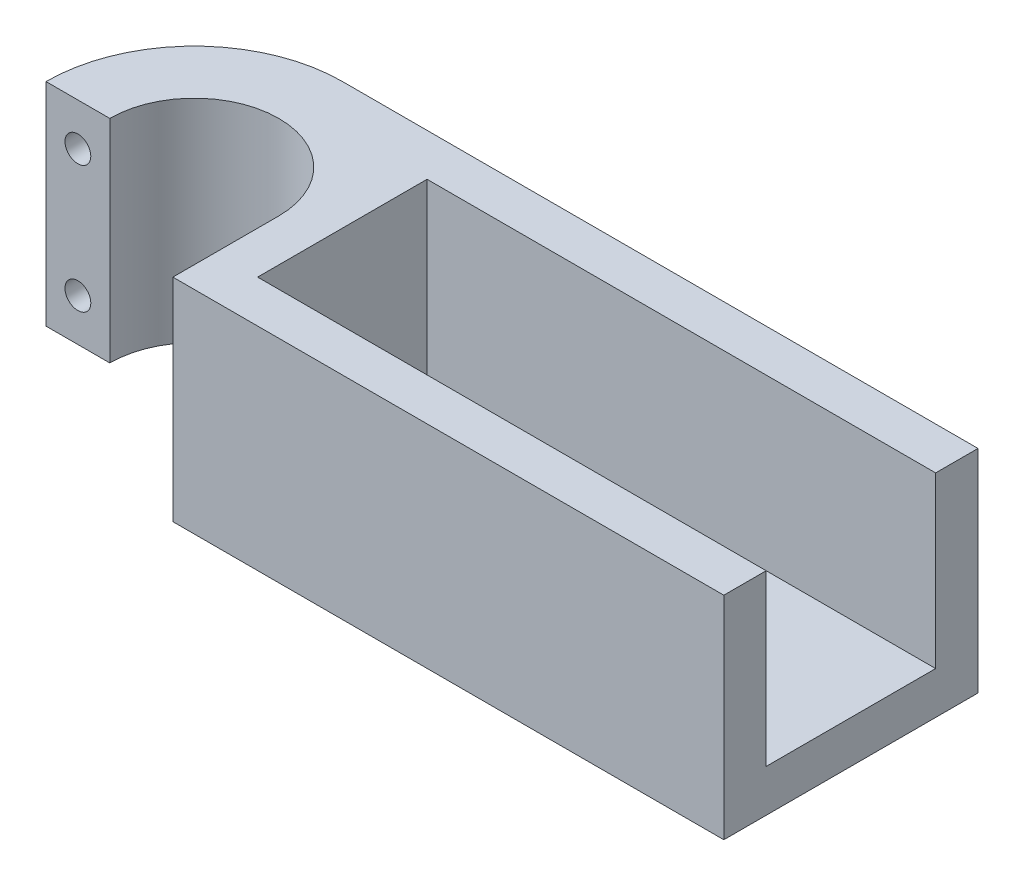
ISO-10303-21;
HEADER;
FILE_DESCRIPTION(('STEP AP214'),'2;1');
FILE_NAME('part.step','',(''),(''),'','','');
FILE_SCHEMA(('AUTOMOTIVE_DESIGN { 1 0 10303 214 1 1 1 1 }'));
ENDSEC;
DATA;
#1=APPLICATION_CONTEXT('core data for automotive mechanical design processes');
#2=APPLICATION_PROTOCOL_DEFINITION('international standard','automotive_design',2000,#1);
#3=PRODUCT_CONTEXT('',#1,'mechanical');
#4=PRODUCT('Part','Part','',(#3));
#5=PRODUCT_RELATED_PRODUCT_CATEGORY('part','',(#4));
#6=PRODUCT_DEFINITION_FORMATION('','',#4);
#7=PRODUCT_DEFINITION_CONTEXT('part definition',#1,'design');
#8=PRODUCT_DEFINITION('design','',#6,#7);
#9=PRODUCT_DEFINITION_SHAPE('','',#8);
#10=(LENGTH_UNIT() NAMED_UNIT(*) SI_UNIT(.MILLI.,.METRE.));
#11=(NAMED_UNIT(*) PLANE_ANGLE_UNIT() SI_UNIT($,.RADIAN.));
#12=(NAMED_UNIT(*) SI_UNIT($,.STERADIAN.) SOLID_ANGLE_UNIT());
#13=UNCERTAINTY_MEASURE_WITH_UNIT(LENGTH_MEASURE(1.E-05),#10,'distance_accuracy_value','');
#14=(GEOMETRIC_REPRESENTATION_CONTEXT(3) GLOBAL_UNCERTAINTY_ASSIGNED_CONTEXT((#13)) GLOBAL_UNIT_ASSIGNED_CONTEXT((#10,
#11,#12)) REPRESENTATION_CONTEXT('',''));
#15=CARTESIAN_POINT('',(0.,0.,0.));
#16=DIRECTION('',(0.,0.,1.));
#17=DIRECTION('',(1.,0.,0.));
#18=AXIS2_PLACEMENT_3D('',#15,#16,#17);
#19=CARTESIAN_POINT('',(-75.,50.,5.));
#20=DIRECTION('',(0.,-1.,0.));
#21=DIRECTION('',(0.,0.,-1.));
#22=AXIS2_PLACEMENT_3D('',#19,#20,#21);
#23=CYLINDRICAL_SURFACE('',#22,35.);
#24=CARTESIAN_POINT('',(-97.225,40.,-22.0379247539451));
#25=CARTESIAN_POINT('',(-97.2249999154107,40.1217781242878,-22.037924808631));
#26=CARTESIAN_POINT('',(-97.2292434311008,40.2435551754505,-22.03443834915));
#27=CARTESIAN_POINT('',(-97.2461444556338,40.4861715398738,-22.0205324891567));
#28=CARTESIAN_POINT('',(-97.2588052450265,40.6070104689267,-22.0101103855437));
#29=CARTESIAN_POINT('',(-97.29231558279,40.8467130135892,-21.9824597791245));
#30=CARTESIAN_POINT('',(-97.3131624383025,40.9655772653928,-21.9652335145792));
#31=CARTESIAN_POINT('',(-97.3626985364783,41.200540758971,-21.9241666135177));
#32=CARTESIAN_POINT('',(-97.3913910492773,41.3166388257914,-21.9003232188642));
#33=CARTESIAN_POINT('',(-97.4560135885504,41.5447537099232,-21.8464003772441));
#34=CARTESIAN_POINT('',(-97.4919122270335,41.6567858211171,-21.8163479590979));
#35=CARTESIAN_POINT('',(-97.5704774527681,41.8766490761934,-21.7502557819437));
#36=CARTESIAN_POINT('',(-97.6131466826403,41.9844785591985,-21.714213684851));
#37=CARTESIAN_POINT('',(-97.7504042118058,42.3007364465511,-21.5976220565663));
#38=CARTESIAN_POINT('',(-97.8542969600859,42.5021224095451,-21.508562128397));
#39=CARTESIAN_POINT('',(-98.0884424835826,42.8941214807585,-21.3049282536217));
#40=CARTESIAN_POINT('',(-98.2199017360487,43.0833660179943,-21.1891452666347));
#41=CARTESIAN_POINT('',(-98.4990342739345,43.4358046044603,-20.9389759161394));
#42=CARTESIAN_POINT('',(-98.646715688457,43.5989854914743,-20.8045802167197));
#43=CARTESIAN_POINT('',(-98.9176134539316,43.8645462736649,-20.5533488300532));
#44=CARTESIAN_POINT('',(-99.0385904323722,43.9722602380154,-20.4396388240866));
#45=CARTESIAN_POINT('',(-99.2851847906452,44.1728699145934,-20.2043415505119));
#46=CARTESIAN_POINT('',(-99.4108040480866,44.2657595483935,-20.0827510802592));
#47=CARTESIAN_POINT('',(-99.6652102722375,44.4374750423969,-19.8326254941393));
#48=CARTESIAN_POINT('',(-99.7940026396369,44.5162747246061,-19.7040780180216));
#49=CARTESIAN_POINT('',(-100.053170662653,44.6603891405067,-19.4412097903955));
#50=CARTESIAN_POINT('',(-100.183546329217,44.7257037809022,-19.3068889989525));
#51=CARTESIAN_POINT('',(-100.500333934203,44.8687707618948,-18.9751022852413));
#52=CARTESIAN_POINT('',(-100.687008644271,44.9400088852529,-18.7750646718863));
#53=CARTESIAN_POINT('',(-101.05890265738,45.0591818636341,-18.3668557774385));
#54=CARTESIAN_POINT('',(-101.244121316672,45.1071069252757,-18.1586811177276));
#55=CARTESIAN_POINT('',(-101.611520681276,45.1819000533325,-17.735557181706));
#56=CARTESIAN_POINT('',(-101.793697295058,45.2087416952934,-17.5205997540319));
#57=CARTESIAN_POINT('',(-102.153480687353,45.2432604096312,-17.0854759277739));
#58=CARTESIAN_POINT('',(-102.331087569428,45.2509379166951,-16.8653096474531));
#59=CARTESIAN_POINT('',(-102.759359421966,45.2484173376315,-16.3210151743233));
#60=CARTESIAN_POINT('',(-103.007046078368,45.2286522927906,-15.9945674390808));
#61=CARTESIAN_POINT('',(-103.489228705027,45.1568681241601,-15.33545718953));
#62=CARTESIAN_POINT('',(-103.723717840796,45.1048324532765,-15.0027915718651));
#63=CARTESIAN_POINT('',(-104.178595589529,44.9715679689156,-14.3332237270435));
#64=CARTESIAN_POINT('',(-104.398969153997,44.8903085910556,-13.9963174219881));
#65=CARTESIAN_POINT('',(-104.824615332964,44.7006494240075,-13.3207971578752));
#66=CARTESIAN_POINT('',(-105.029893154379,44.5922590503592,-12.982183831086));
#67=CARTESIAN_POINT('',(-105.392185687574,44.3692050336553,-12.3615083098085));
#68=CARTESIAN_POINT('',(-105.551562190295,44.2585551777332,-12.0793704667619));
#69=CARTESIAN_POINT('',(-105.859283805239,44.0183687116361,-11.5168792352724));
#70=CARTESIAN_POINT('',(-106.007624739871,43.8888250034511,-11.2365265589711));
#71=CARTESIAN_POINT('',(-106.221481308024,43.6791745045985,-10.8190910195904));
#72=CARTESIAN_POINT('',(-106.291363406446,43.6066874192709,-10.6803797054591));
#73=CARTESIAN_POINT('',(-106.428118471045,43.4562546982067,-10.4044492795062));
#74=CARTESIAN_POINT('',(-106.494991773295,43.3783096746009,-10.2672300023342));
#75=CARTESIAN_POINT('',(-106.625549109989,43.2165566379257,-9.99491332255993));
#76=CARTESIAN_POINT('',(-106.689235733516,43.1327535215946,-9.85981426068012));
#77=CARTESIAN_POINT('',(-106.813277955504,42.9585935876611,-9.5923631662042));
#78=CARTESIAN_POINT('',(-106.873634233882,42.8682381165604,-9.46001057636073));
#79=CARTESIAN_POINT('',(-106.991113823784,42.6794882318361,-9.19821609977389));
#80=CARTESIAN_POINT('',(-107.048214613845,42.5810471775618,-9.06879752658682));
#81=CARTESIAN_POINT('',(-107.158304838297,42.3754483251802,-8.81529937294273));
#82=CARTESIAN_POINT('',(-107.211296432936,42.2682951686513,-8.69121700268087));
#83=CARTESIAN_POINT('',(-107.312172167147,42.0443257742245,-8.45140631656059));
#84=CARTESIAN_POINT('',(-107.360086849129,41.927575831915,-8.33562957862316));
#85=CARTESIAN_POINT('',(-107.44999627857,41.681961635379,-8.11532740300083));
#86=CARTESIAN_POINT('',(-107.492002045605,41.5531206987431,-8.01078111005009));
#87=CARTESIAN_POINT('',(-107.558585385327,41.3155787679582,-7.84307226421092));
#88=CARTESIAN_POINT('',(-107.58488098733,41.2100592881853,-7.77613921366072));
#89=CARTESIAN_POINT('',(-107.631958845153,40.9903951765956,-7.65541210087108));
#90=CARTESIAN_POINT('',(-107.652740427352,40.8762494931431,-7.60161964401916));
#91=CARTESIAN_POINT('',(-107.687454279443,40.63829840144,-7.51130445919044));
#92=CARTESIAN_POINT('',(-107.70129103642,40.5143840483513,-7.47502280604169));
#93=CARTESIAN_POINT('',(-107.720010750978,40.2613989964105,-7.42584609771399));
#94=CARTESIAN_POINT('',(-107.724913389468,40.1323402730182,-7.4128996382818));
#95=CARTESIAN_POINT('',(-107.725074347427,39.8896233525652,-7.41247273105721));
#96=CARTESIAN_POINT('',(-107.721412161553,39.7759623491926,-7.42214187010994));
#97=CARTESIAN_POINT('',(-107.707069991782,39.5521657594021,-7.45985409228865));
#98=CARTESIAN_POINT('',(-107.696381563841,39.4420345823093,-7.48791928342492));
#99=CARTESIAN_POINT('',(-107.664719066444,39.1940941646017,-7.57054530902052));
#100=CARTESIAN_POINT('',(-107.641569290443,39.0584507802367,-7.63065829087444));
#101=CARTESIAN_POINT('',(-107.587473572435,38.7988223661625,-7.76957728022407));
#102=CARTESIAN_POINT('',(-107.556508096265,38.6748676328855,-7.84843009582294));
#103=CARTESIAN_POINT('',(-107.491848781969,38.4487945517033,-8.01102334458738));
#104=CARTESIAN_POINT('',(-107.458662717822,38.3457158434814,-8.09365896658741));
#105=CARTESIAN_POINT('',(-107.388410900763,38.1474431518931,-8.26648221599134));
#106=CARTESIAN_POINT('',(-107.351341752957,38.0522562005583,-8.35667643769997));
#107=CARTESIAN_POINT('',(-107.273918624063,37.8686094969454,-8.54268640386901));
#108=CARTESIAN_POINT('',(-107.233558014818,37.7801640491571,-8.63851337727045));
#109=CARTESIAN_POINT('',(-107.150037437781,37.6092745053181,-8.83424834433986));
#110=CARTESIAN_POINT('',(-107.106876394647,37.5268327407291,-8.93415790016707));
#111=CARTESIAN_POINT('',(-107.012483759435,37.3572150463447,-9.14978494076725));
#112=CARTESIAN_POINT('',(-106.960919589521,37.2707462180554,-9.26591111499844));
#113=CARTESIAN_POINT('',(-106.854934684282,37.1037202071743,-9.50102725706437));
#114=CARTESIAN_POINT('',(-106.800514176661,37.0231625545723,-9.6200169962097));
#115=CARTESIAN_POINT('',(-106.633147336963,36.7892044520561,-9.98045650992841));
#116=CARTESIAN_POINT('',(-106.516184083837,36.6436738923244,-10.2251736498033));
#117=CARTESIAN_POINT('',(-106.272280534462,36.3700200569242,-10.7200798156189));
#118=CARTESIAN_POINT('',(-106.145316960102,36.2419394102939,-10.9702805676721));
#119=CARTESIAN_POINT('',(-105.882169604637,36.0018254241895,-11.473376909284));
#120=CARTESIAN_POINT('',(-105.745989091988,35.8897864395718,-11.7262715170349));
#121=CARTESIAN_POINT('',(-105.503514444625,35.7097010132412,-12.1633241454726));
#122=CARTESIAN_POINT('',(-105.399345357432,35.6380473118126,-12.3471889628274));
#123=CARTESIAN_POINT('',(-105.186401146321,35.5025869464587,-12.715145822319));
#124=CARTESIAN_POINT('',(-105.077625750777,35.4387807461541,-12.8992378772325));
#125=CARTESIAN_POINT('',(-104.744394811485,35.2590997117713,-13.4514421500238));
#126=CARTESIAN_POINT('',(-104.513098440885,35.1550098427781,-13.8193669144296));
#127=CARTESIAN_POINT('',(-104.033642201404,34.9802318136123,-14.5509231613959));
#128=CARTESIAN_POINT('',(-103.785520521297,34.9094707294803,-14.9145623038732));
#129=CARTESIAN_POINT('',(-103.273123876612,34.8044406613318,-15.6355437370542));
#130=CARTESIAN_POINT('',(-103.008860428951,34.7701459733645,-15.9928902882382));
#131=CARTESIAN_POINT('',(-102.57074987718,34.7482221294049,-16.56220491131));
#132=CARTESIAN_POINT('',(-102.401311357387,34.7477014117857,-16.7771204104458));
#133=CARTESIAN_POINT('',(-102.057769976827,34.7637811113039,-17.2025164715966));
#134=CARTESIAN_POINT('',(-101.883668343565,34.7803770650083,-17.4129981751902));
#135=CARTESIAN_POINT('',(-101.531908697683,34.8323448407016,-17.8283118123692));
#136=CARTESIAN_POINT('',(-101.354254089076,34.8676994486674,-18.0331487449308));
#137=CARTESIAN_POINT('',(-100.99660148341,34.9590784338062,-18.4360660200119));
#138=CARTESIAN_POINT('',(-100.816604146773,35.0150971024725,-18.6341482120541));
#139=CARTESIAN_POINT('',(-100.501443208595,35.132935390585,-18.9732294371569));
#140=CARTESIAN_POINT('',(-100.366380585456,35.1897591407922,-19.1160637216323));
#141=CARTESIAN_POINT('',(-100.097028613981,35.3170589379767,-19.3962474167093));
#142=CARTESIAN_POINT('',(-99.9627390746558,35.3875314496503,-19.5335982365507));
#143=CARTESIAN_POINT('',(-99.6962810855715,35.5429849725273,-19.8018020029073));
#144=CARTESIAN_POINT('',(-99.5641109271361,35.6279535791488,-19.9326603825601));
#145=CARTESIAN_POINT('',(-99.3034150353102,35.8132200072786,-20.1868458628302));
#146=CARTESIAN_POINT('',(-99.1748882608734,35.9135133965184,-20.3101751266475));
#147=CARTESIAN_POINT('',(-98.8591168215945,36.185465195012,-20.6087991805737));
#148=CARTESIAN_POINT('',(-98.6753087279373,36.367453572739,-20.7785665141471));
#149=CARTESIAN_POINT('',(-98.328466513907,36.7690551599239,-21.0928621620296));
#150=CARTESIAN_POINT('',(-98.1654080544354,36.988623565736,-21.2374201218202));
#151=CARTESIAN_POINT('',(-97.8944521073403,37.4241001226978,-21.4739667148292));
#152=CARTESIAN_POINT('',(-97.7818899898765,37.634464191102,-21.5707047725082));
#153=CARTESIAN_POINT('',(-97.6334560830509,37.9661145274318,-21.6970203717602));
#154=CARTESIAN_POINT('',(-97.5873686919138,38.079385775315,-21.7360026993472));
#155=CARTESIAN_POINT('',(-97.5026860931085,38.3107000455324,-21.8073158333026));
#156=CARTESIAN_POINT('',(-97.464087584689,38.4287409377838,-21.8396495704378));
#157=CARTESIAN_POINT('',(-97.3962532805671,38.6645774845488,-21.8962771432472));
#158=CARTESIAN_POINT('',(-97.366733424717,38.7822326810726,-21.9208159310127));
#159=CARTESIAN_POINT('',(-97.3157589791035,39.0204308019643,-21.9630858633601));
#160=CARTESIAN_POINT('',(-97.2943008397807,39.1409724305141,-21.9808200040893));
#161=CARTESIAN_POINT('',(-97.2598091078733,39.3840801061646,-22.0092835962234));
#162=CARTESIAN_POINT('',(-97.2467758296382,39.5066462286285,-22.0200127862587));
#163=CARTESIAN_POINT('',(-97.2293713519973,39.7528086078204,-22.0343333098705));
#164=CARTESIAN_POINT('',(-97.2250000858514,39.876404856604,-22.0379246984433));
#165=CARTESIAN_POINT('',(-97.225,40.,-22.0379247539451));
#166=B_SPLINE_CURVE_WITH_KNOTS('',3,(#24,#25,#26,#27,#28,#29,#30,#31,#32,#33,#34,#35,#36,#37,
#38,#39,#40,#41,#42,#43,#44,#45,#46,#47,#48,#49,#50,#51,#52,#53,#54,#55,#56,#57,#58,#59,#60,#61,
#62,#63,#64,#65,#66,#67,#68,#69,#70,#71,#72,#73,#74,#75,#76,#77,#78,#79,#80,#81,#82,#83,#84,#85,
#86,#87,#88,#89,#90,#91,#92,#93,#94,#95,#96,#97,#98,#99,#100,#101,#102,#103,#104,#105,#106,#107,
#108,#109,#110,#111,#112,#113,#114,#115,#116,#117,#118,#119,#120,#121,#122,#123,#124,#125,#126,
#127,#128,#129,#130,#131,#132,#133,#134,#135,#136,#137,#138,#139,#140,#141,#142,#143,#144,#145,
#146,#147,#148,#149,#150,#151,#152,#153,#154,#155,#156,#157,#158,#159,#160,#161,#162,#163,#164,
#165),.UNSPECIFIED.,.T.,.F.,(4,2,2,2,2,2,2,2,2,2,2,2,2,2,2,2,2,2,2,2,2,2,2,2,2,2,2,2,2,2,2,2,2,
2,2,2,2,2,2,2,2,2,2,2,2,2,2,2,2,2,2,2,2,2,2,2,2,2,2,2,2,2,2,2,2,2,2,2,2,2,4),(0.,
0.36520960981692,0.730561639999614,1.09579358585931,1.46117799611764,1.8250041360267,
2.18897263133015,2.9163136279026,3.68723698190057,4.45854843174837,5.05150424264131,
5.64470256226797,6.23899179703911,6.83328514324228,7.68019154850691,8.52745341674879,
9.37577549566263,10.2240783324837,11.4530302229559,12.6826127927223,13.9134851115841,
15.1439308593722,16.170541700701,17.1975392156283,17.7116509026087,18.2257050218839,
18.7393344699186,19.2528586651526,19.7695869448464,20.2860417069804,20.7991882160903,
21.3113646944412,21.6936208017261,22.0759235859443,22.4633492578644,22.8499204358813,
23.1904327779794,23.5313550931922,23.97931283479,24.4284014619291,24.8364585219632,
25.2448753627147,25.6541359814594,26.0635546936134,26.5244262198465,26.9852610614044,
27.9077388254623,28.8324312137956,29.7567973940813,30.4260384861491,31.095319097193,
32.4343000248497,33.7703374707453,35.1054325627148,35.9259447864421,36.7462431031841,
37.5657899654835,38.3851105949335,38.9985258956331,39.6117825214123,40.2245169802095,
40.8370745568299,41.761637262716,42.6851052687769,43.4539332241943,43.8385824817799,
44.2230618168017,44.5938731088685,44.9645209415146,45.3351826030297,45.7058414086148),.UNSPECIFIED.);
#167=CARTESIAN_POINT('',(-97.225,40.,-22.0379247539451));
#168=VERTEX_POINT('',#167);
#169=EDGE_CURVE('E175',#168,#168,#166,.T.);
#170=ORIENTED_EDGE('',*,*,#169,.T.);
#171=EDGE_LOOP('',(#170));
#172=FACE_BOUND('',#171,.T.);
#173=CARTESIAN_POINT('',(-97.225,10.,-22.0379247539451));
#174=CARTESIAN_POINT('',(-97.2249999154107,10.1217781242878,-22.037924808631));
#175=CARTESIAN_POINT('',(-97.2292434311008,10.2435551754505,-22.03443834915));
#176=CARTESIAN_POINT('',(-97.2461444556338,10.4861715398738,-22.0205324891567));
#177=CARTESIAN_POINT('',(-97.2588052450265,10.6070104689267,-22.0101103855437));
#178=CARTESIAN_POINT('',(-97.2923155827901,10.8467130135892,-21.9824597791245));
#179=CARTESIAN_POINT('',(-97.3131624383025,10.9655772653928,-21.9652335145792));
#180=CARTESIAN_POINT('',(-97.3626985364783,11.200540758971,-21.9241666135177));
#181=CARTESIAN_POINT('',(-97.3913910492773,11.3166388257914,-21.9003232188642));
#182=CARTESIAN_POINT('',(-97.4560135885504,11.5447537099232,-21.846400377244));
#183=CARTESIAN_POINT('',(-97.4919122270335,11.6567858211171,-21.8163479590979));
#184=CARTESIAN_POINT('',(-97.5704774527682,11.8766490761934,-21.7502557819437));
#185=CARTESIAN_POINT('',(-97.6131466826404,11.9844785591985,-21.714213684851));
#186=CARTESIAN_POINT('',(-97.7504042118058,12.3007364465511,-21.5976220565663));
#187=CARTESIAN_POINT('',(-97.8542969600859,12.5021224095451,-21.508562128397));
#188=CARTESIAN_POINT('',(-98.0884424835826,12.8941214807585,-21.3049282536217));
#189=CARTESIAN_POINT('',(-98.2199017360487,13.0833660179944,-21.1891452666346));
#190=CARTESIAN_POINT('',(-98.4990342739346,13.4358046044603,-20.9389759161394));
#191=CARTESIAN_POINT('',(-98.646715688457,13.5989854914743,-20.8045802167197));
#192=CARTESIAN_POINT('',(-98.9176134539316,13.8645462736649,-20.5533488300532));
#193=CARTESIAN_POINT('',(-99.0385904323722,13.9722602380154,-20.4396388240866));
#194=CARTESIAN_POINT('',(-99.2851847906453,14.1728699145934,-20.2043415505119));
#195=CARTESIAN_POINT('',(-99.4108040480866,14.2657595483935,-20.0827510802592));
#196=CARTESIAN_POINT('',(-99.6652102722375,14.4374750423969,-19.8326254941393));
#197=CARTESIAN_POINT('',(-99.7940026396369,14.5162747246061,-19.7040780180215));
#198=CARTESIAN_POINT('',(-100.053170662653,14.6603891405067,-19.4412097903955));
#199=CARTESIAN_POINT('',(-100.183546329217,14.7257037809022,-19.3068889989525));
#200=CARTESIAN_POINT('',(-100.500333934203,14.8687707618948,-18.9751022852413));
#201=CARTESIAN_POINT('',(-100.687008644271,14.9400088852529,-18.7750646718863));
#202=CARTESIAN_POINT('',(-101.05890265738,15.0591818636341,-18.3668557774385));
#203=CARTESIAN_POINT('',(-101.244121316672,15.1071069252757,-18.1586811177276));
#204=CARTESIAN_POINT('',(-101.611520681276,15.1819000533325,-17.735557181706));
#205=CARTESIAN_POINT('',(-101.793697295058,15.2087416952934,-17.5205997540319));
#206=CARTESIAN_POINT('',(-102.153480687353,15.2432604096312,-17.0854759277739));
#207=CARTESIAN_POINT('',(-102.331087569428,15.2509379166951,-16.8653096474531));
#208=CARTESIAN_POINT('',(-102.759359421966,15.2484173376315,-16.3210151743233));
#209=CARTESIAN_POINT('',(-103.007046078368,15.2286522927906,-15.9945674390808));
#210=CARTESIAN_POINT('',(-103.489228705027,15.1568681241601,-15.33545718953));
#211=CARTESIAN_POINT('',(-103.723717840796,15.1048324532765,-15.0027915718651));
#212=CARTESIAN_POINT('',(-104.178595589529,14.9715679689156,-14.3332237270435));
#213=CARTESIAN_POINT('',(-104.398969153997,14.8903085910556,-13.9963174219881));
#214=CARTESIAN_POINT('',(-104.824615332964,14.7006494240076,-13.3207971578752));
#215=CARTESIAN_POINT('',(-105.029893154379,14.5922590503592,-12.982183831086));
#216=CARTESIAN_POINT('',(-105.392185687574,14.3692050336553,-12.3615083098085));
#217=CARTESIAN_POINT('',(-105.551562190295,14.2585551777332,-12.0793704667619));
#218=CARTESIAN_POINT('',(-105.859283805239,14.0183687116361,-11.5168792352724));
#219=CARTESIAN_POINT('',(-106.007624739871,13.8888250034511,-11.2365265589711));
#220=CARTESIAN_POINT('',(-106.221481308024,13.6791745045986,-10.8190910195904));
#221=CARTESIAN_POINT('',(-106.291363406446,13.6066874192709,-10.6803797054591));
#222=CARTESIAN_POINT('',(-106.428118471045,13.4562546982068,-10.4044492795061));
#223=CARTESIAN_POINT('',(-106.494991773295,13.3783096746009,-10.2672300023342));
#224=CARTESIAN_POINT('',(-106.625549109989,13.2165566379257,-9.99491332255993));
#225=CARTESIAN_POINT('',(-106.689235733516,13.1327535215946,-9.85981426068011));
#226=CARTESIAN_POINT('',(-106.813277955504,12.9585935876611,-9.59236316620419));
#227=CARTESIAN_POINT('',(-106.873634233882,12.8682381165604,-9.46001057636072));
#228=CARTESIAN_POINT('',(-106.991113823784,12.6794882318362,-9.19821609977387));
#229=CARTESIAN_POINT('',(-107.048214613845,12.5810471775618,-9.06879752658681));
#230=CARTESIAN_POINT('',(-107.158304838297,12.3754483251802,-8.81529937294272));
#231=CARTESIAN_POINT('',(-107.211296432936,12.2682951686513,-8.69121700268085));
#232=CARTESIAN_POINT('',(-107.312172167147,12.0443257742245,-8.45140631656058));
#233=CARTESIAN_POINT('',(-107.360086849129,11.927575831915,-8.33562957862315));
#234=CARTESIAN_POINT('',(-107.44999627857,11.681961635379,-8.11532740300082));
#235=CARTESIAN_POINT('',(-107.492002045605,11.5531206987431,-8.01078111005007));
#236=CARTESIAN_POINT('',(-107.558585385327,11.3155787679582,-7.8430722642109));
#237=CARTESIAN_POINT('',(-107.58488098733,11.2100592881853,-7.7761392136607));
#238=CARTESIAN_POINT('',(-107.631958845153,10.9903951765957,-7.65541210087106));
#239=CARTESIAN_POINT('',(-107.652740427352,10.8762494931431,-7.60161964401914));
#240=CARTESIAN_POINT('',(-107.687454279443,10.63829840144,-7.51130445919042));
#241=CARTESIAN_POINT('',(-107.70129103642,10.5143840483513,-7.47502280604166));
#242=CARTESIAN_POINT('',(-107.720010750978,10.2613989964105,-7.42584609771395));
#243=CARTESIAN_POINT('',(-107.724913389468,10.1323402730182,-7.41289963828176));
#244=CARTESIAN_POINT('',(-107.725074347427,9.88962335256526,-7.41247273105717));
#245=CARTESIAN_POINT('',(-107.721412161553,9.77596234919262,-7.4221418701099));
#246=CARTESIAN_POINT('',(-107.707069991782,9.55216575940214,-7.4598540922886));
#247=CARTESIAN_POINT('',(-107.696381563841,9.44203458230934,-7.48791928342487));
#248=CARTESIAN_POINT('',(-107.664719066444,9.1940941646017,-7.57054530902047));
#249=CARTESIAN_POINT('',(-107.641569290443,9.05845078023673,-7.63065829087439));
#250=CARTESIAN_POINT('',(-107.587473572435,8.79882236616253,-7.76957728022402));
#251=CARTESIAN_POINT('',(-107.556508096265,8.67486763288553,-7.84843009582288));
#252=CARTESIAN_POINT('',(-107.491848781969,8.44879455170329,-8.01102334458733));
#253=CARTESIAN_POINT('',(-107.458662717822,8.34571584348144,-8.09365896658736));
#254=CARTESIAN_POINT('',(-107.388410900763,8.14744315189312,-8.26648221599129));
#255=CARTESIAN_POINT('',(-107.351341752957,8.0522562005583,-8.3566764376999));
#256=CARTESIAN_POINT('',(-107.273918624063,7.86860949694545,-8.54268640386893));
#257=CARTESIAN_POINT('',(-107.233558014818,7.78016404915719,-8.63851337727036));
#258=CARTESIAN_POINT('',(-107.150037437781,7.60927450531813,-8.83424834433976));
#259=CARTESIAN_POINT('',(-107.106876394647,7.52683274072917,-8.93415790016697));
#260=CARTESIAN_POINT('',(-107.012483759435,7.35721504634476,-9.14978494076714));
#261=CARTESIAN_POINT('',(-106.960919589521,7.27074621805547,-9.26591111499832));
#262=CARTESIAN_POINT('',(-106.854934684282,7.10372020717435,-9.50102725706424));
#263=CARTESIAN_POINT('',(-106.800514176661,7.02316255457233,-9.62001699620957));
#264=CARTESIAN_POINT('',(-106.633147336963,6.78920445205621,-9.98045650992825));
#265=CARTESIAN_POINT('',(-106.516184083837,6.64367389232448,-10.2251736498031));
#266=CARTESIAN_POINT('',(-106.272280534462,6.37002005692425,-10.7200798156188));
#267=CARTESIAN_POINT('',(-106.145316960102,6.24193941029394,-10.9702805676719));
#268=CARTESIAN_POINT('',(-105.882169604637,6.00182542418963,-11.4733769092838));
#269=CARTESIAN_POINT('',(-105.745989091988,5.88978643957185,-11.7262715170347));
#270=CARTESIAN_POINT('',(-105.503514444625,5.70970101324128,-12.1633241454724));
#271=CARTESIAN_POINT('',(-105.399345357432,5.63804731181271,-12.3471889628271));
#272=CARTESIAN_POINT('',(-105.186401146321,5.50258694645875,-12.7151458223188));
#273=CARTESIAN_POINT('',(-105.077625750777,5.43878074615417,-12.8992378772323));
#274=CARTESIAN_POINT('',(-104.744394811485,5.25909971177134,-13.4514421500236));
#275=CARTESIAN_POINT('',(-104.513098440885,5.1550098427781,-13.8193669144294));
#276=CARTESIAN_POINT('',(-104.033642201404,4.98023181361236,-14.5509231613958));
#277=CARTESIAN_POINT('',(-103.785520521297,4.90947072948033,-14.914562303873));
#278=CARTESIAN_POINT('',(-103.273123876612,4.8044406613318,-15.635543737054));
#279=CARTESIAN_POINT('',(-103.008860428951,4.77014597336456,-15.992890288238));
#280=CARTESIAN_POINT('',(-102.57074987718,4.74822212940489,-16.5622049113098));
#281=CARTESIAN_POINT('',(-102.401311357387,4.74770141178575,-16.7771204104457));
#282=CARTESIAN_POINT('',(-102.057769976827,4.76378111130394,-17.2025164715965));
#283=CARTESIAN_POINT('',(-101.883668343565,4.78037706500833,-17.4129981751901));
#284=CARTESIAN_POINT('',(-101.531908697683,4.83234484070158,-17.8283118123691));
#285=CARTESIAN_POINT('',(-101.354254089076,4.86769944866742,-18.0331487449307));
#286=CARTESIAN_POINT('',(-100.99660148341,4.95907843380621,-18.4360660200118));
#287=CARTESIAN_POINT('',(-100.816604146773,5.01509710247252,-18.634148212054));
#288=CARTESIAN_POINT('',(-100.501443208595,5.13293539058495,-18.9732294371569));
#289=CARTESIAN_POINT('',(-100.366380585456,5.18975914079215,-19.1160637216323));
#290=CARTESIAN_POINT('',(-100.097028613981,5.31705893797672,-19.3962474167092));
#291=CARTESIAN_POINT('',(-99.9627390746559,5.38753144965029,-19.5335982365507));
#292=CARTESIAN_POINT('',(-99.6962810855716,5.54298497252726,-19.8018020029072));
#293=CARTESIAN_POINT('',(-99.5641109271361,5.62795357914881,-19.93266038256));
#294=CARTESIAN_POINT('',(-99.3034150353103,5.81322000727853,-20.1868458628302));
#295=CARTESIAN_POINT('',(-99.1748882608734,5.91351339651835,-20.3101751266474));
#296=CARTESIAN_POINT('',(-98.8591168215946,6.18546519501203,-20.6087991805736));
#297=CARTESIAN_POINT('',(-98.6753087279373,6.36745357273894,-20.7785665141471));
#298=CARTESIAN_POINT('',(-98.3284665139071,6.76905515992388,-21.0928621620295));
#299=CARTESIAN_POINT('',(-98.1654080544354,6.98862356573596,-21.2374201218202));
#300=CARTESIAN_POINT('',(-97.8944521073403,7.42410012269784,-21.4739667148292));
#301=CARTESIAN_POINT('',(-97.7818899898766,7.634464191102,-21.5707047725081));
#302=CARTESIAN_POINT('',(-97.633456083051,7.96611452743182,-21.6970203717602));
#303=CARTESIAN_POINT('',(-97.5873686919139,8.07938577531494,-21.7360026993472));
#304=CARTESIAN_POINT('',(-97.5026860931085,8.31070004553241,-21.8073158333025));
#305=CARTESIAN_POINT('',(-97.4640875846891,8.42874093778374,-21.8396495704378));
#306=CARTESIAN_POINT('',(-97.3962532805671,8.66457748454882,-21.8962771432472));
#307=CARTESIAN_POINT('',(-97.366733424717,8.78223268107257,-21.9208159310127));
#308=CARTESIAN_POINT('',(-97.3157589791035,9.02043080196432,-21.9630858633601));
#309=CARTESIAN_POINT('',(-97.2943008397808,9.14097243051412,-21.9808200040893));
#310=CARTESIAN_POINT('',(-97.2598091078733,9.38408010616457,-22.0092835962234));
#311=CARTESIAN_POINT('',(-97.2467758296382,9.50664622862847,-22.0200127862587));
#312=CARTESIAN_POINT('',(-97.2293713519974,9.75280860782041,-22.0343333098705));
#313=CARTESIAN_POINT('',(-97.2250000858514,9.87640485660404,-22.0379246984433));
#314=CARTESIAN_POINT('',(-97.225,10.,-22.0379247539451));
#315=B_SPLINE_CURVE_WITH_KNOTS('',3,(#173,#174,#175,#176,#177,#178,#179,#180,#181,#182,#183,
#184,#185,#186,#187,#188,#189,#190,#191,#192,#193,#194,#195,#196,#197,#198,#199,#200,#201,#202,
#203,#204,#205,#206,#207,#208,#209,#210,#211,#212,#213,#214,#215,#216,#217,#218,#219,#220,#221,
#222,#223,#224,#225,#226,#227,#228,#229,#230,#231,#232,#233,#234,#235,#236,#237,#238,#239,#240,
#241,#242,#243,#244,#245,#246,#247,#248,#249,#250,#251,#252,#253,#254,#255,#256,#257,#258,#259,
#260,#261,#262,#263,#264,#265,#266,#267,#268,#269,#270,#271,#272,#273,#274,#275,#276,#277,#278,
#279,#280,#281,#282,#283,#284,#285,#286,#287,#288,#289,#290,#291,#292,#293,#294,#295,#296,#297,
#298,#299,#300,#301,#302,#303,#304,#305,#306,#307,#308,#309,#310,#311,#312,#313,#314),
.UNSPECIFIED.,.T.,.F.,(4,2,2,2,2,2,2,2,2,2,2,2,2,2,2,2,2,2,2,2,2,2,2,2,2,2,2,2,2,2,2,2,2,2,2,2,
2,2,2,2,2,2,2,2,2,2,2,2,2,2,2,2,2,2,2,2,2,2,2,2,2,2,2,2,2,2,2,2,2,2,4),(0.,0.365209609816919,
0.730561639999617,1.09579358585933,1.46117799611763,1.82500413602668,2.18897263133014,
2.9163136279026,3.68723698190058,4.45854843174837,5.05150424264131,5.64470256226797,
6.23899179703911,6.83328514324227,7.68019154850691,8.52745341674878,9.37577549566261,
10.2240783324836,11.4530302229558,12.6826127927223,13.9134851115841,15.1439308593721,
16.170541700701,17.1975392156282,17.7116509026087,18.2257050218839,18.7393344699186,
19.2528586651526,19.7695869448463,20.2860417069804,20.7991882160902,21.3113646944411,
21.693620801726,22.0759235859443,22.4633492578644,22.8499204358813,23.1904327779793,
23.5313550931922,23.9793128347899,24.4284014619291,24.8364585219632,25.2448753627147,
25.6541359814594,26.0635546936133,26.5244262198464,26.9852610614043,27.9077388254621,
28.8324312137954,29.7567973940811,30.4260384861489,31.0953190971928,32.4343000248495,
33.7703374707452,35.1054325627146,35.925944786442,36.7462431031841,37.5657899654834,
38.3851105949334,38.9985258956331,39.6117825214123,40.2245169802095,40.8370745568299,
41.761637262716,42.6851052687769,43.4539332241943,43.8385824817799,44.2230618168017,
44.5938731088685,44.9645209415146,45.3351826030297,45.7058414086148),.UNSPECIFIED.);
#316=CARTESIAN_POINT('',(-97.225,10.,-22.0379247539451));
#317=VERTEX_POINT('',#316);
#318=EDGE_CURVE('E167',#317,#317,#315,.T.);
#319=ORIENTED_EDGE('',*,*,#318,.T.);
#320=EDGE_LOOP('',(#319));
#321=FACE_BOUND('',#320,.T.);
#322=CARTESIAN_POINT('',(-75.,0.,5.));
#323=DIRECTION('',(0.,1.,0.));
#324=DIRECTION('',(0.,0.,1.));
#325=AXIS2_PLACEMENT_3D('',#322,#323,#324);
#326=CIRCLE('',#325,35.);
#327=CARTESIAN_POINT('',(-75.,0.,-30.));
#328=VERTEX_POINT('',#327);
#329=CARTESIAN_POINT('',(-110.,0.,5.));
#330=VERTEX_POINT('',#329);
#331=EDGE_CURVE('E239',#328,#330,#326,.T.);
#332=ORIENTED_EDGE('',*,*,#331,.T.);
#333=DIRECTION('',(0.,-1.,0.));
#334=VECTOR('',#333,1.);
#335=CARTESIAN_POINT('',(-110.,50.,5.));
#336=LINE('',#335,#334);
#337=CARTESIAN_POINT('',(-110.,50.,5.));
#338=VERTEX_POINT('',#337);
#339=EDGE_CURVE('E163',#338,#330,#336,.T.);
#340=ORIENTED_EDGE('',*,*,#339,.F.);
#341=CARTESIAN_POINT('',(-75.,50.,5.));
#342=DIRECTION('',(0.,1.,0.));
#343=DIRECTION('',(0.,0.,1.));
#344=AXIS2_PLACEMENT_3D('',#341,#342,#343);
#345=CIRCLE('',#344,35.);
#346=CARTESIAN_POINT('',(-75.,50.,-30.));
#347=VERTEX_POINT('',#346);
#348=EDGE_CURVE('E100',#347,#338,#345,.T.);
#349=ORIENTED_EDGE('',*,*,#348,.F.);
#350=DIRECTION('',(0.,-1.,0.));
#351=VECTOR('',#350,1.);
#352=CARTESIAN_POINT('',(-75.,50.,-30.));
#353=LINE('',#352,#351);
#354=EDGE_CURVE('E64',#347,#328,#353,.T.);
#355=ORIENTED_EDGE('',*,*,#354,.T.);
#356=EDGE_LOOP('',(#332,#340,#349,#355));
#357=FACE_BOUND('',#356,.T.);
#358=ADVANCED_FACE('F39',(#172,#321,#357),#23,.T.);
#359=CARTESIAN_POINT('',(-94.95,50.,5.));
#360=DIRECTION('',(0.,0.,1.));
#361=DIRECTION('',(1.,0.,0.));
#362=AXIS2_PLACEMENT_3D('',#359,#360,#361);
#363=PLANE('',#362);
#364=CARTESIAN_POINT('',(-102.475,40.,5.));
#365=DIRECTION('',(0.,0.,1.));
#366=DIRECTION('',(1.,0.,0.));
#367=AXIS2_PLACEMENT_3D('',#364,#365,#366);
#368=CIRCLE('',#367,3.04999999999999);
#369=CARTESIAN_POINT('',(-99.425,40.,5.));
#370=VERTEX_POINT('',#369);
#371=EDGE_CURVE('E227',#370,#370,#368,.T.);
#372=ORIENTED_EDGE('',*,*,#371,.F.);
#373=EDGE_LOOP('',(#372));
#374=FACE_BOUND('',#373,.T.);
#375=CARTESIAN_POINT('',(-102.475,10.,5.));
#376=DIRECTION('',(0.,0.,1.));
#377=DIRECTION('',(1.,0.,0.));
#378=AXIS2_PLACEMENT_3D('',#375,#376,#377);
#379=CIRCLE('',#378,3.04999999999999);
#380=CARTESIAN_POINT('',(-99.425,10.,5.));
#381=VERTEX_POINT('',#380);
#382=EDGE_CURVE('E231',#381,#381,#379,.T.);
#383=ORIENTED_EDGE('',*,*,#382,.F.);
#384=EDGE_LOOP('',(#383));
#385=FACE_BOUND('',#384,.T.);
#386=DIRECTION('',(-1.,0.,0.));
#387=VECTOR('',#386,1.);
#388=CARTESIAN_POINT('',(-94.95,0.,5.));
#389=LINE('',#388,#387);
#390=CARTESIAN_POINT('',(-94.95,0.,5.));
#391=VERTEX_POINT('',#390);
#392=EDGE_CURVE('E234',#391,#330,#389,.T.);
#393=ORIENTED_EDGE('',*,*,#392,.F.);
#394=DIRECTION('',(0.,-1.,0.));
#395=VECTOR('',#394,1.);
#396=CARTESIAN_POINT('',(-94.95,50.,5.));
#397=LINE('',#396,#395);
#398=CARTESIAN_POINT('',(-94.95,50.,5.));
#399=VERTEX_POINT('',#398);
#400=EDGE_CURVE('E160',#399,#391,#397,.T.);
#401=ORIENTED_EDGE('',*,*,#400,.F.);
#402=DIRECTION('',(-1.,0.,0.));
#403=VECTOR('',#402,1.);
#404=CARTESIAN_POINT('',(-94.95,50.,5.));
#405=LINE('',#404,#403);
#406=EDGE_CURVE('E280',#399,#338,#405,.T.);
#407=ORIENTED_EDGE('',*,*,#406,.T.);
#408=ORIENTED_EDGE('',*,*,#339,.T.);
#409=EDGE_LOOP('',(#393,#401,#407,#408));
#410=FACE_BOUND('',#409,.T.);
#411=ADVANCED_FACE('F216',(#374,#385,#410),#363,.T.);
#412=CARTESIAN_POINT('',(-75.,50.,5.));
#413=DIRECTION('',(0.,-1.,0.));
#414=DIRECTION('',(0.,0.,-1.));
#415=AXIS2_PLACEMENT_3D('',#412,#413,#414);
#416=CYLINDRICAL_SURFACE('',#415,19.95);
#417=CARTESIAN_POINT('',(-75.,0.,5.));
#418=DIRECTION('',(0.,1.,0.));
#419=DIRECTION('',(0.,0.,1.));
#420=AXIS2_PLACEMENT_3D('',#417,#418,#419);
#421=CIRCLE('',#420,19.95);
#422=CARTESIAN_POINT('',(-55.05,0.,5.));
#423=VERTEX_POINT('',#422);
#424=EDGE_CURVE('E238',#423,#391,#421,.T.);
#425=ORIENTED_EDGE('',*,*,#424,.F.);
#426=DIRECTION('',(0.,-1.,0.));
#427=VECTOR('',#426,1.);
#428=CARTESIAN_POINT('',(-55.05,50.,5.));
#429=LINE('',#428,#427);
#430=CARTESIAN_POINT('',(-55.05,50.,5.));
#431=VERTEX_POINT('',#430);
#432=EDGE_CURVE('E153',#431,#423,#429,.T.);
#433=ORIENTED_EDGE('',*,*,#432,.F.);
#434=CARTESIAN_POINT('',(-75.,50.,5.));
#435=DIRECTION('',(0.,1.,0.));
#436=DIRECTION('',(0.,0.,1.));
#437=AXIS2_PLACEMENT_3D('',#434,#435,#436);
#438=CIRCLE('',#437,19.95);
#439=EDGE_CURVE('E283',#431,#399,#438,.T.);
#440=ORIENTED_EDGE('',*,*,#439,.T.);
#441=ORIENTED_EDGE('',*,*,#400,.T.);
#442=EDGE_LOOP('',(#425,#433,#440,#441));
#443=FACE_BOUND('',#442,.T.);
#444=ADVANCED_FACE('F213',(#443),#416,.F.);
#445=CARTESIAN_POINT('',(-55.05,50.,5.));
#446=DIRECTION('',(1.,0.,0.));
#447=DIRECTION('',(0.,0.,-1.));
#448=AXIS2_PLACEMENT_3D('',#445,#446,#447);
#449=PLANE('',#448);
#450=DIRECTION('',(0.,0.,1.));
#451=VECTOR('',#450,1.);
#452=CARTESIAN_POINT('',(-55.05,0.,5.));
#453=LINE('',#452,#451);
#454=CARTESIAN_POINT('',(-55.05,0.,30.));
#455=VERTEX_POINT('',#454);
#456=EDGE_CURVE('E243',#423,#455,#453,.T.);
#457=ORIENTED_EDGE('',*,*,#456,.T.);
#458=DIRECTION('',(0.,-1.,0.));
#459=VECTOR('',#458,1.);
#460=CARTESIAN_POINT('',(-55.05,50.,30.));
#461=LINE('',#460,#459);
#462=CARTESIAN_POINT('',(-55.05,50.,30.));
#463=VERTEX_POINT('',#462);
#464=EDGE_CURVE('E148',#463,#455,#461,.T.);
#465=ORIENTED_EDGE('',*,*,#464,.F.);
#466=DIRECTION('',(0.,0.,1.));
#467=VECTOR('',#466,1.);
#468=CARTESIAN_POINT('',(-55.05,50.,5.));
#469=LINE('',#468,#467);
#470=EDGE_CURVE('E137',#431,#463,#469,.T.);
#471=ORIENTED_EDGE('',*,*,#470,.F.);
#472=ORIENTED_EDGE('',*,*,#432,.T.);
#473=EDGE_LOOP('',(#457,#465,#471,#472));
#474=FACE_BOUND('',#473,.T.);
#475=ADVANCED_FACE('F210',(#474),#449,.F.);
#476=CARTESIAN_POINT('',(-55.05,50.,30.));
#477=DIRECTION('',(0.,0.,-1.));
#478=DIRECTION('',(-1.,0.,0.));
#479=AXIS2_PLACEMENT_3D('',#476,#477,#478);
#480=PLANE('',#479);
#481=DIRECTION('',(1.,0.,0.));
#482=VECTOR('',#481,1.);
#483=CARTESIAN_POINT('',(-55.05,0.,30.));
#484=LINE('',#483,#482);
#485=CARTESIAN_POINT('',(75.,0.,30.));
#486=VERTEX_POINT('',#485);
#487=EDGE_CURVE('E145',#455,#486,#484,.T.);
#488=ORIENTED_EDGE('',*,*,#487,.T.);
#489=DIRECTION('',(0.,-1.,0.));
#490=VECTOR('',#489,1.);
#491=CARTESIAN_POINT('',(75.,50.,30.));
#492=LINE('',#491,#490);
#493=CARTESIAN_POINT('',(75.,50.,30.));
#494=VERTEX_POINT('',#493);
#495=EDGE_CURVE('E122',#494,#486,#492,.T.);
#496=ORIENTED_EDGE('',*,*,#495,.F.);
#497=DIRECTION('',(1.,0.,0.));
#498=VECTOR('',#497,1.);
#499=CARTESIAN_POINT('',(-55.05,50.,30.));
#500=LINE('',#499,#498);
#501=EDGE_CURVE('E130',#463,#494,#500,.T.);
#502=ORIENTED_EDGE('',*,*,#501,.F.);
#503=ORIENTED_EDGE('',*,*,#464,.T.);
#504=EDGE_LOOP('',(#488,#496,#502,#503));
#505=FACE_BOUND('',#504,.T.);
#506=ADVANCED_FACE('F143',(#505),#480,.F.);
#507=CARTESIAN_POINT('',(75.,50.,-30.));
#508=DIRECTION('',(1.,0.,0.));
#509=DIRECTION('',(0.,0.,-1.));
#510=AXIS2_PLACEMENT_3D('',#507,#508,#509);
#511=PLANE('',#510);
#512=DIRECTION('',(0.,1.,0.));
#513=VECTOR('',#512,1.);
#514=CARTESIAN_POINT('',(75.,50.,-20.));
#515=LINE('',#514,#513);
#516=CARTESIAN_POINT('',(75.,10.,-20.));
#517=VERTEX_POINT('',#516);
#518=CARTESIAN_POINT('',(75.,50.,-20.));
#519=VERTEX_POINT('',#518);
#520=EDGE_CURVE('E339',#517,#519,#515,.T.);
#521=ORIENTED_EDGE('',*,*,#520,.F.);
#522=DIRECTION('',(0.,0.,1.));
#523=VECTOR('',#522,1.);
#524=CARTESIAN_POINT('',(75.,10.,-30.));
#525=LINE('',#524,#523);
#526=CARTESIAN_POINT('',(75.,10.,20.));
#527=VERTEX_POINT('',#526);
#528=EDGE_CURVE('E11',#517,#527,#525,.T.);
#529=ORIENTED_EDGE('',*,*,#528,.T.);
#530=DIRECTION('',(0.,1.,0.));
#531=VECTOR('',#530,1.);
#532=CARTESIAN_POINT('',(75.,50.,20.));
#533=LINE('',#532,#531);
#534=CARTESIAN_POINT('',(75.,50.,20.));
#535=VERTEX_POINT('',#534);
#536=EDGE_CURVE('E126',#527,#535,#533,.T.);
#537=ORIENTED_EDGE('',*,*,#536,.T.);
#538=DIRECTION('',(0.,0.,1.));
#539=VECTOR('',#538,1.);
#540=CARTESIAN_POINT('',(75.,50.,-30.));
#541=LINE('',#540,#539);
#542=EDGE_CURVE('E116',#535,#494,#541,.T.);
#543=ORIENTED_EDGE('',*,*,#542,.T.);
#544=ORIENTED_EDGE('',*,*,#495,.T.);
#545=DIRECTION('',(0.,0.,1.));
#546=VECTOR('',#545,1.);
#547=CARTESIAN_POINT('',(75.,0.,-30.));
#548=LINE('',#547,#546);
#549=CARTESIAN_POINT('',(75.,0.,-30.));
#550=VERTEX_POINT('',#549);
#551=EDGE_CURVE('E252',#550,#486,#548,.T.);
#552=ORIENTED_EDGE('',*,*,#551,.F.);
#553=DIRECTION('',(0.,-1.,0.));
#554=VECTOR('',#553,1.);
#555=CARTESIAN_POINT('',(75.,50.,-30.));
#556=LINE('',#555,#554);
#557=CARTESIAN_POINT('',(75.,50.,-30.));
#558=VERTEX_POINT('',#557);
#559=EDGE_CURVE('E149',#558,#550,#556,.T.);
#560=ORIENTED_EDGE('',*,*,#559,.F.);
#561=EDGE_CURVE('E129',#558,#519,#541,.T.);
#562=ORIENTED_EDGE('',*,*,#561,.T.);
#563=EDGE_LOOP('',(#521,#529,#537,#543,#544,#552,#560,#562));
#564=FACE_BOUND('',#563,.T.);
#565=ADVANCED_FACE('F119',(#564),#511,.T.);
#566=CARTESIAN_POINT('',(-75.,50.,-30.));
#567=DIRECTION('',(0.,0.,-1.));
#568=DIRECTION('',(-1.,0.,0.));
#569=AXIS2_PLACEMENT_3D('',#566,#567,#568);
#570=PLANE('',#569);
#571=DIRECTION('',(1.,0.,0.));
#572=VECTOR('',#571,1.);
#573=CARTESIAN_POINT('',(-75.,0.,-30.));
#574=LINE('',#573,#572);
#575=EDGE_CURVE('E255',#328,#550,#574,.T.);
#576=ORIENTED_EDGE('',*,*,#575,.F.);
#577=ORIENTED_EDGE('',*,*,#354,.F.);
#578=DIRECTION('',(1.,0.,0.));
#579=VECTOR('',#578,1.);
#580=CARTESIAN_POINT('',(-75.,50.,-30.));
#581=LINE('',#580,#579);
#582=EDGE_CURVE('E259',#347,#558,#581,.T.);
#583=ORIENTED_EDGE('',*,*,#582,.T.);
#584=ORIENTED_EDGE('',*,*,#559,.T.);
#585=EDGE_LOOP('',(#576,#577,#583,#584));
#586=FACE_BOUND('',#585,.T.);
#587=ADVANCED_FACE('F200',(#586),#570,.T.);
#588=CARTESIAN_POINT('',(-75.,50.,5.));
#589=DIRECTION('',(0.,1.,0.));
#590=DIRECTION('',(0.,0.,1.));
#591=AXIS2_PLACEMENT_3D('',#588,#589,#590);
#592=PLANE('',#591);
#593=DIRECTION('',(-1.,0.,0.));
#594=VECTOR('',#593,1.);
#595=CARTESIAN_POINT('',(-75.,50.,-20.));
#596=LINE('',#595,#594);
#597=CARTESIAN_POINT('',(-45.05,50.,-20.));
#598=VERTEX_POINT('',#597);
#599=EDGE_CURVE('E48',#519,#598,#596,.T.);
#600=ORIENTED_EDGE('',*,*,#599,.F.);
#601=ORIENTED_EDGE('',*,*,#561,.F.);
#602=ORIENTED_EDGE('',*,*,#582,.F.);
#603=ORIENTED_EDGE('',*,*,#348,.T.);
#604=ORIENTED_EDGE('',*,*,#406,.F.);
#605=ORIENTED_EDGE('',*,*,#439,.F.);
#606=ORIENTED_EDGE('',*,*,#470,.T.);
#607=ORIENTED_EDGE('',*,*,#501,.T.);
#608=ORIENTED_EDGE('',*,*,#542,.F.);
#609=DIRECTION('',(-1.,0.,0.));
#610=VECTOR('',#609,1.);
#611=CARTESIAN_POINT('',(-75.,50.,20.));
#612=LINE('',#611,#610);
#613=CARTESIAN_POINT('',(-45.05,50.,20.));
#614=VERTEX_POINT('',#613);
#615=EDGE_CURVE('E166',#535,#614,#612,.T.);
#616=ORIENTED_EDGE('',*,*,#615,.T.);
#617=DIRECTION('',(0.,0.,1.));
#618=VECTOR('',#617,1.);
#619=CARTESIAN_POINT('',(-45.05,50.,-20.));
#620=LINE('',#619,#618);
#621=EDGE_CURVE('E291',#598,#614,#620,.T.);
#622=ORIENTED_EDGE('',*,*,#621,.F.);
#623=EDGE_LOOP('',(#600,#601,#602,#603,#604,#605,#606,#607,#608,#616,#622));
#624=FACE_BOUND('',#623,.T.);
#625=ADVANCED_FACE('F134',(#624),#592,.T.);
#626=CARTESIAN_POINT('',(-75.,0.,5.));
#627=DIRECTION('',(0.,1.,0.));
#628=DIRECTION('',(0.,0.,1.));
#629=AXIS2_PLACEMENT_3D('',#626,#627,#628);
#630=PLANE('',#629);
#631=ORIENTED_EDGE('',*,*,#331,.F.);
#632=ORIENTED_EDGE('',*,*,#575,.T.);
#633=ORIENTED_EDGE('',*,*,#551,.T.);
#634=ORIENTED_EDGE('',*,*,#487,.F.);
#635=ORIENTED_EDGE('',*,*,#456,.F.);
#636=ORIENTED_EDGE('',*,*,#424,.T.);
#637=ORIENTED_EDGE('',*,*,#392,.T.);
#638=EDGE_LOOP('',(#631,#632,#633,#634,#635,#636,#637));
#639=FACE_BOUND('',#638,.T.);
#640=ADVANCED_FACE('F196',(#639),#630,.F.);
#641=CARTESIAN_POINT('',(-102.475,10.,-2.5));
#642=DIRECTION('',(0.,0.,1.));
#643=DIRECTION('',(1.,0.,0.));
#644=AXIS2_PLACEMENT_3D('',#641,#642,#643);
#645=CYLINDRICAL_SURFACE('',#644,3.04999999999999);
#646=CARTESIAN_POINT('',(-102.475,10.,-2.5));
#647=DIRECTION('',(0.,0.,1.));
#648=DIRECTION('',(1.,0.,0.));
#649=AXIS2_PLACEMENT_3D('',#646,#647,#648);
#650=CIRCLE('',#649,3.04999999999999);
#651=CARTESIAN_POINT('',(-99.425,10.,-2.5));
#652=VERTEX_POINT('',#651);
#653=EDGE_CURVE('E269',#652,#652,#650,.T.);
#654=ORIENTED_EDGE('',*,*,#653,.F.);
#655=EDGE_LOOP('',(#654));
#656=FACE_BOUND('',#655,.T.);
#657=ORIENTED_EDGE('',*,*,#382,.T.);
#658=EDGE_LOOP('',(#657));
#659=FACE_BOUND('',#658,.T.);
#660=ADVANCED_FACE('F192',(#656,#659),#645,.F.);
#661=CARTESIAN_POINT('',(-102.475,40.,-2.5));
#662=DIRECTION('',(0.,0.,1.));
#663=DIRECTION('',(1.,0.,0.));
#664=AXIS2_PLACEMENT_3D('',#661,#662,#663);
#665=CYLINDRICAL_SURFACE('',#664,3.04999999999999);
#666=CARTESIAN_POINT('',(-102.475,40.,-2.5));
#667=DIRECTION('',(0.,0.,1.));
#668=DIRECTION('',(1.,0.,0.));
#669=AXIS2_PLACEMENT_3D('',#666,#667,#668);
#670=CIRCLE('',#669,3.04999999999999);
#671=CARTESIAN_POINT('',(-99.425,40.,-2.5));
#672=VERTEX_POINT('',#671);
#673=EDGE_CURVE('E273',#672,#672,#670,.T.);
#674=ORIENTED_EDGE('',*,*,#673,.F.);
#675=EDGE_LOOP('',(#674));
#676=FACE_BOUND('',#675,.T.);
#677=ORIENTED_EDGE('',*,*,#371,.T.);
#678=EDGE_LOOP('',(#677));
#679=FACE_BOUND('',#678,.T.);
#680=ADVANCED_FACE('F188',(#676,#679),#665,.F.);
#681=CARTESIAN_POINT('',(-102.475,10.,-52.5));
#682=DIRECTION('',(0.,0.,1.));
#683=DIRECTION('',(1.,0.,0.));
#684=AXIS2_PLACEMENT_3D('',#681,#682,#683);
#685=CYLINDRICAL_SURFACE('',#684,5.25);
#686=CARTESIAN_POINT('',(-102.475,10.,-2.5));
#687=DIRECTION('',(0.,0.,1.));
#688=DIRECTION('',(1.,0.,0.));
#689=AXIS2_PLACEMENT_3D('',#686,#687,#688);
#690=CIRCLE('',#689,5.25);
#691=CARTESIAN_POINT('',(-97.225,10.,-2.5));
#692=VERTEX_POINT('',#691);
#693=EDGE_CURVE('E342',#692,#692,#690,.T.);
#694=ORIENTED_EDGE('',*,*,#693,.T.);
#695=EDGE_LOOP('',(#694));
#696=FACE_BOUND('',#695,.T.);
#697=ORIENTED_EDGE('',*,*,#318,.F.);
#698=EDGE_LOOP('',(#697));
#699=FACE_BOUND('',#698,.T.);
#700=ADVANCED_FACE('F182',(#696,#699),#685,.F.);
#701=CARTESIAN_POINT('',(-102.475,10.,-2.5));
#702=DIRECTION('',(0.,0.,1.));
#703=DIRECTION('',(1.,0.,0.));
#704=AXIS2_PLACEMENT_3D('',#701,#702,#703);
#705=PLANE('',#704);
#706=ORIENTED_EDGE('',*,*,#653,.T.);
#707=EDGE_LOOP('',(#706));
#708=FACE_BOUND('',#707,.T.);
#709=ORIENTED_EDGE('',*,*,#693,.F.);
#710=EDGE_LOOP('',(#709));
#711=FACE_BOUND('',#710,.T.);
#712=ADVANCED_FACE('F187',(#708,#711),#705,.F.);
#713=CARTESIAN_POINT('',(-102.475,40.,-52.5));
#714=DIRECTION('',(0.,0.,1.));
#715=DIRECTION('',(1.,0.,0.));
#716=AXIS2_PLACEMENT_3D('',#713,#714,#715);
#717=CYLINDRICAL_SURFACE('',#716,5.25);
#718=CARTESIAN_POINT('',(-102.475,40.,-2.5));
#719=DIRECTION('',(0.,0.,1.));
#720=DIRECTION('',(1.,0.,0.));
#721=AXIS2_PLACEMENT_3D('',#718,#719,#720);
#722=CIRCLE('',#721,5.25);
#723=CARTESIAN_POINT('',(-97.225,40.,-2.5));
#724=VERTEX_POINT('',#723);
#725=EDGE_CURVE('E176',#724,#724,#722,.T.);
#726=ORIENTED_EDGE('',*,*,#725,.T.);
#727=EDGE_LOOP('',(#726));
#728=FACE_BOUND('',#727,.T.);
#729=ORIENTED_EDGE('',*,*,#169,.F.);
#730=EDGE_LOOP('',(#729));
#731=FACE_BOUND('',#730,.T.);
#732=ADVANCED_FACE('F351',(#728,#731),#717,.F.);
#733=CARTESIAN_POINT('',(-102.475,40.,-2.5));
#734=DIRECTION('',(0.,0.,1.));
#735=DIRECTION('',(1.,0.,0.));
#736=AXIS2_PLACEMENT_3D('',#733,#734,#735);
#737=PLANE('',#736);
#738=ORIENTED_EDGE('',*,*,#673,.T.);
#739=EDGE_LOOP('',(#738));
#740=FACE_BOUND('',#739,.T.);
#741=ORIENTED_EDGE('',*,*,#725,.F.);
#742=EDGE_LOOP('',(#741));
#743=FACE_BOUND('',#742,.T.);
#744=ADVANCED_FACE('F356',(#740,#743),#737,.F.);
#745=CARTESIAN_POINT('',(103.478027857705,10.,-20.));
#746=DIRECTION('',(0.,0.,-1.));
#747=DIRECTION('',(-1.,0.,0.));
#748=AXIS2_PLACEMENT_3D('',#745,#746,#747);
#749=PLANE('',#748);
#750=ORIENTED_EDGE('',*,*,#520,.T.);
#751=ORIENTED_EDGE('',*,*,#599,.T.);
#752=DIRECTION('',(0.,1.,0.));
#753=VECTOR('',#752,1.);
#754=CARTESIAN_POINT('',(-45.05,10.,-20.));
#755=LINE('',#754,#753);
#756=CARTESIAN_POINT('',(-45.05,10.,-20.));
#757=VERTEX_POINT('',#756);
#758=EDGE_CURVE('E55',#757,#598,#755,.T.);
#759=ORIENTED_EDGE('',*,*,#758,.F.);
#760=DIRECTION('',(-1.,0.,0.));
#761=VECTOR('',#760,1.);
#762=CARTESIAN_POINT('',(103.478027857705,10.,-20.));
#763=LINE('',#762,#761);
#764=EDGE_CURVE('E318',#517,#757,#763,.T.);
#765=ORIENTED_EDGE('',*,*,#764,.F.);
#766=EDGE_LOOP('',(#750,#751,#759,#765));
#767=FACE_BOUND('',#766,.T.);
#768=ADVANCED_FACE('F323',(#767),#749,.F.);
#769=CARTESIAN_POINT('',(103.478027857705,10.,20.));
#770=DIRECTION('',(0.,0.,-1.));
#771=DIRECTION('',(-1.,0.,0.));
#772=AXIS2_PLACEMENT_3D('',#769,#770,#771);
#773=PLANE('',#772);
#774=DIRECTION('',(-1.,0.,0.));
#775=VECTOR('',#774,1.);
#776=CARTESIAN_POINT('',(103.478027857705,10.,20.));
#777=LINE('',#776,#775);
#778=CARTESIAN_POINT('',(-45.05,10.,20.));
#779=VERTEX_POINT('',#778);
#780=EDGE_CURVE('E325',#527,#779,#777,.T.);
#781=ORIENTED_EDGE('',*,*,#780,.T.);
#782=DIRECTION('',(0.,1.,0.));
#783=VECTOR('',#782,1.);
#784=CARTESIAN_POINT('',(-45.05,10.,20.));
#785=LINE('',#784,#783);
#786=EDGE_CURVE('E307',#779,#614,#785,.T.);
#787=ORIENTED_EDGE('',*,*,#786,.T.);
#788=ORIENTED_EDGE('',*,*,#615,.F.);
#789=ORIENTED_EDGE('',*,*,#536,.F.);
#790=EDGE_LOOP('',(#781,#787,#788,#789));
#791=FACE_BOUND('',#790,.T.);
#792=ADVANCED_FACE('F304',(#791),#773,.T.);
#793=CARTESIAN_POINT('',(-45.05,10.,-20.));
#794=DIRECTION('',(-1.,0.,0.));
#795=DIRECTION('',(0.,0.,1.));
#796=AXIS2_PLACEMENT_3D('',#793,#794,#795);
#797=PLANE('',#796);
#798=ORIENTED_EDGE('',*,*,#621,.T.);
#799=ORIENTED_EDGE('',*,*,#786,.F.);
#800=DIRECTION('',(0.,0.,1.));
#801=VECTOR('',#800,1.);
#802=CARTESIAN_POINT('',(-45.05,10.,-20.));
#803=LINE('',#802,#801);
#804=EDGE_CURVE('E320',#757,#779,#803,.T.);
#805=ORIENTED_EDGE('',*,*,#804,.F.);
#806=ORIENTED_EDGE('',*,*,#758,.T.);
#807=EDGE_LOOP('',(#798,#799,#805,#806));
#808=FACE_BOUND('',#807,.T.);
#809=ADVANCED_FACE('F327',(#808),#797,.F.);
#810=CARTESIAN_POINT('',(0.,10.,0.));
#811=DIRECTION('',(0.,1.,0.));
#812=DIRECTION('',(0.,0.,1.));
#813=AXIS2_PLACEMENT_3D('',#810,#811,#812);
#814=PLANE('',#813);
#815=ORIENTED_EDGE('',*,*,#764,.T.);
#816=ORIENTED_EDGE('',*,*,#804,.T.);
#817=ORIENTED_EDGE('',*,*,#780,.F.);
#818=ORIENTED_EDGE('',*,*,#528,.F.);
#819=EDGE_LOOP('',(#815,#816,#817,#818));
#820=FACE_BOUND('',#819,.T.);
#821=ADVANCED_FACE('F319',(#820),#814,.T.);
#822=CLOSED_SHELL('',(#358,#411,#444,#475,#506,#565,#587,#625,#640,#660,#680,#700,#712,#732,
#744,#768,#792,#809,#821));
#823=MANIFOLD_SOLID_BREP('B2',#822);
#824=ADVANCED_BREP_SHAPE_REPRESENTATION('',(#18,#823),#14);
#825=SHAPE_DEFINITION_REPRESENTATION(#9,#824);
ENDSEC;
END-ISO-10303-21;
